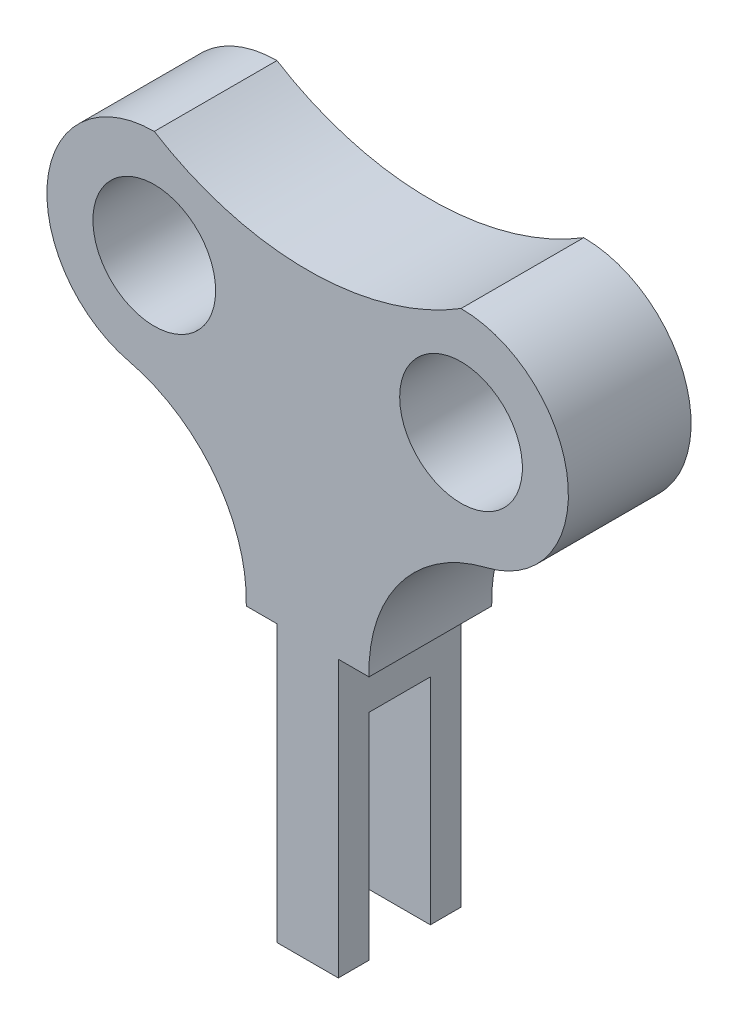
ISO-10303-21;
HEADER;
FILE_DESCRIPTION(('STEP AP214'),'2;1');
FILE_NAME('part.step','',(''),(''),'','','');
FILE_SCHEMA(('AUTOMOTIVE_DESIGN { 1 0 10303 214 1 1 1 1 }'));
ENDSEC;
DATA;
#1=APPLICATION_CONTEXT('core data for automotive mechanical design processes');
#2=APPLICATION_PROTOCOL_DEFINITION('international standard','automotive_design',2000,#1);
#3=PRODUCT_CONTEXT('',#1,'mechanical');
#4=PRODUCT('Part','Part','',(#3));
#5=PRODUCT_RELATED_PRODUCT_CATEGORY('part','',(#4));
#6=PRODUCT_DEFINITION_FORMATION('','',#4);
#7=PRODUCT_DEFINITION_CONTEXT('part definition',#1,'design');
#8=PRODUCT_DEFINITION('design','',#6,#7);
#9=PRODUCT_DEFINITION_SHAPE('','',#8);
#10=(LENGTH_UNIT() NAMED_UNIT(*) SI_UNIT(.MILLI.,.METRE.));
#11=(NAMED_UNIT(*) PLANE_ANGLE_UNIT() SI_UNIT($,.RADIAN.));
#12=(NAMED_UNIT(*) SI_UNIT($,.STERADIAN.) SOLID_ANGLE_UNIT());
#13=UNCERTAINTY_MEASURE_WITH_UNIT(LENGTH_MEASURE(1.E-05),#10,'distance_accuracy_value','');
#14=(GEOMETRIC_REPRESENTATION_CONTEXT(3) GLOBAL_UNCERTAINTY_ASSIGNED_CONTEXT((#13)) GLOBAL_UNIT_ASSIGNED_CONTEXT((#10,
#11,#12)) REPRESENTATION_CONTEXT('',''));
#15=CARTESIAN_POINT('',(0.,0.,0.));
#16=DIRECTION('',(0.,0.,1.));
#17=DIRECTION('',(1.,0.,0.));
#18=AXIS2_PLACEMENT_3D('',#15,#16,#17);
#19=CARTESIAN_POINT('',(-4.99999999999998,-87.,20.));
#20=DIRECTION('',(0.,1.,0.));
#21=DIRECTION('',(0.,0.,1.));
#22=AXIS2_PLACEMENT_3D('',#19,#20,#21);
#23=PLANE('',#22);
#24=DIRECTION('',(0.,0.,-1.));
#25=VECTOR('',#24,1.);
#26=CARTESIAN_POINT('',(-4.99999999999998,-87.,20.));
#27=LINE('',#26,#25);
#28=CARTESIAN_POINT('',(-4.99999999999998,-87.,20.));
#29=VERTEX_POINT('',#28);
#30=CARTESIAN_POINT('',(-4.99999999999998,-87.,15.));
#31=VERTEX_POINT('',#30);
#32=EDGE_CURVE('E213',#29,#31,#27,.T.);
#33=ORIENTED_EDGE('',*,*,#32,.T.);
#34=DIRECTION('',(1.,0.,0.));
#35=VECTOR('',#34,1.);
#36=CARTESIAN_POINT('',(-41.4005494464026,-87.,15.));
#37=LINE('',#36,#35);
#38=CARTESIAN_POINT('',(5.00000000000002,-87.,15.));
#39=VERTEX_POINT('',#38);
#40=EDGE_CURVE('E284',#31,#39,#37,.T.);
#41=ORIENTED_EDGE('',*,*,#40,.T.);
#42=DIRECTION('',(0.,0.,-1.));
#43=VECTOR('',#42,1.);
#44=CARTESIAN_POINT('',(5.00000000000002,-87.,20.));
#45=LINE('',#44,#43);
#46=CARTESIAN_POINT('',(5.00000000000002,-87.,20.));
#47=VERTEX_POINT('',#46);
#48=EDGE_CURVE('E208',#47,#39,#45,.T.);
#49=ORIENTED_EDGE('',*,*,#48,.F.);
#50=DIRECTION('',(1.,0.,0.));
#51=VECTOR('',#50,1.);
#52=CARTESIAN_POINT('',(-4.99999999999998,-87.,20.));
#53=LINE('',#52,#51);
#54=EDGE_CURVE('E253',#29,#47,#53,.T.);
#55=ORIENTED_EDGE('',*,*,#54,.F.);
#56=EDGE_LOOP('',(#33,#41,#49,#55));
#57=FACE_BOUND('',#56,.T.);
#58=ADVANCED_FACE('F41',(#57),#23,.F.);
#59=CARTESIAN_POINT('',(0.,58.,20.));
#60=DIRECTION('',(0.,0.,1.));
#61=DIRECTION('',(1.,0.,0.));
#62=AXIS2_PLACEMENT_3D('',#59,#60,#61);
#63=PLANE('',#62);
#64=CARTESIAN_POINT('',(-25.,0.,20.));
#65=DIRECTION('',(0.,0.,1.));
#66=DIRECTION('',(1.,0.,0.));
#67=AXIS2_PLACEMENT_3D('',#64,#65,#66);
#68=CIRCLE('',#67,10.);
#69=CARTESIAN_POINT('',(-15.,0.,20.));
#70=VERTEX_POINT('',#69);
#71=EDGE_CURVE('E173',#70,#70,#68,.T.);
#72=ORIENTED_EDGE('',*,*,#71,.F.);
#73=EDGE_LOOP('',(#72));
#74=FACE_BOUND('',#73,.T.);
#75=CARTESIAN_POINT('',(0.,58.,20.));
#76=DIRECTION('',(0.,0.,-1.));
#77=DIRECTION('',(1.,0.,0.));
#78=AXIS2_PLACEMENT_3D('',#75,#76,#77);
#79=CIRCLE('',#78,47.594642555649);
#80=CARTESIAN_POINT('',(25.,17.5,20.));
#81=VERTEX_POINT('',#80);
#82=CARTESIAN_POINT('',(-25.,17.5,20.));
#83=VERTEX_POINT('',#82);
#84=EDGE_CURVE('E200',#81,#83,#79,.T.);
#85=ORIENTED_EDGE('',*,*,#84,.T.);
#86=CARTESIAN_POINT('',(-25.,0.,20.));
#87=DIRECTION('',(0.,0.,1.));
#88=DIRECTION('',(1.,0.,0.));
#89=AXIS2_PLACEMENT_3D('',#86,#87,#88);
#90=CIRCLE('',#89,17.5);
#91=CARTESIAN_POINT('',(-29.1137151317504,-17.0096251520958,20.));
#92=VERTEX_POINT('',#91);
#93=EDGE_CURVE('E113',#83,#92,#90,.T.);
#94=ORIENTED_EDGE('',*,*,#93,.T.);
#95=CARTESIAN_POINT('',(-34.990451034251,-41.3090896550897,20.));
#96=DIRECTION('',(0.,0.,-1.));
#97=DIRECTION('',(1.,0.,0.));
#98=AXIS2_PLACEMENT_3D('',#95,#96,#97);
#99=CIRCLE('',#98,25.);
#100=CARTESIAN_POINT('',(-9.99999999999999,-42.,20.));
#101=VERTEX_POINT('',#100);
#102=EDGE_CURVE('E231',#92,#101,#99,.T.);
#103=ORIENTED_EDGE('',*,*,#102,.T.);
#104=DIRECTION('',(1.,0.,0.));
#105=VECTOR('',#104,1.);
#106=CARTESIAN_POINT('',(-9.99999999999999,-42.,20.));
#107=LINE('',#106,#105);
#108=CARTESIAN_POINT('',(-4.99999999999999,-42.,20.));
#109=VERTEX_POINT('',#108);
#110=EDGE_CURVE('E254',#101,#109,#107,.T.);
#111=ORIENTED_EDGE('',*,*,#110,.T.);
#112=DIRECTION('',(0.,-1.,0.));
#113=VECTOR('',#112,1.);
#114=CARTESIAN_POINT('',(-4.99999999999998,-87.,20.));
#115=LINE('',#114,#113);
#116=EDGE_CURVE('E249',#109,#29,#115,.T.);
#117=ORIENTED_EDGE('',*,*,#116,.T.);
#118=ORIENTED_EDGE('',*,*,#54,.T.);
#119=DIRECTION('',(0.,1.,0.));
#120=VECTOR('',#119,1.);
#121=CARTESIAN_POINT('',(5.00000000000002,-87.,20.));
#122=LINE('',#121,#120);
#123=CARTESIAN_POINT('',(5.00000000000002,-42.,20.));
#124=VERTEX_POINT('',#123);
#125=EDGE_CURVE('E143',#47,#124,#122,.T.);
#126=ORIENTED_EDGE('',*,*,#125,.T.);
#127=DIRECTION('',(1.,0.,0.));
#128=VECTOR('',#127,1.);
#129=CARTESIAN_POINT('',(5.00000000000002,-42.,20.));
#130=LINE('',#129,#128);
#131=CARTESIAN_POINT('',(10.,-42.,20.));
#132=VERTEX_POINT('',#131);
#133=EDGE_CURVE('E135',#124,#132,#130,.T.);
#134=ORIENTED_EDGE('',*,*,#133,.T.);
#135=CARTESIAN_POINT('',(34.990451034251,-41.3090896550897,20.));
#136=DIRECTION('',(0.,0.,-1.));
#137=DIRECTION('',(-1.,0.,0.));
#138=AXIS2_PLACEMENT_3D('',#135,#136,#137);
#139=CIRCLE('',#138,25.);
#140=CARTESIAN_POINT('',(29.1137151317504,-17.0096251520958,20.));
#141=VERTEX_POINT('',#140);
#142=EDGE_CURVE('E140',#132,#141,#139,.T.);
#143=ORIENTED_EDGE('',*,*,#142,.T.);
#144=CARTESIAN_POINT('',(25.,0.,20.));
#145=DIRECTION('',(0.,0.,1.));
#146=DIRECTION('',(-1.,0.,0.));
#147=AXIS2_PLACEMENT_3D('',#144,#145,#146);
#148=CIRCLE('',#147,17.5);
#149=EDGE_CURVE('E66',#141,#81,#148,.T.);
#150=ORIENTED_EDGE('',*,*,#149,.T.);
#151=EDGE_LOOP('',(#85,#94,#103,#111,#117,#118,#126,#134,#143,#150));
#152=FACE_BOUND('',#151,.T.);
#153=CARTESIAN_POINT('',(25.,0.,20.));
#154=DIRECTION('',(0.,0.,1.));
#155=DIRECTION('',(-1.,0.,0.));
#156=AXIS2_PLACEMENT_3D('',#153,#154,#155);
#157=CIRCLE('',#156,10.);
#158=CARTESIAN_POINT('',(15.,0.,20.));
#159=VERTEX_POINT('',#158);
#160=EDGE_CURVE('E272',#159,#159,#157,.T.);
#161=ORIENTED_EDGE('',*,*,#160,.F.);
#162=EDGE_LOOP('',(#161));
#163=FACE_BOUND('',#162,.T.);
#164=ADVANCED_FACE('F137',(#74,#152,#163),#63,.T.);
#165=CARTESIAN_POINT('',(0.,58.,0.));
#166=DIRECTION('',(0.,0.,1.));
#167=DIRECTION('',(1.,0.,0.));
#168=AXIS2_PLACEMENT_3D('',#165,#166,#167);
#169=PLANE('',#168);
#170=CARTESIAN_POINT('',(0.,58.,0.));
#171=DIRECTION('',(0.,0.,-1.));
#172=DIRECTION('',(1.,0.,0.));
#173=AXIS2_PLACEMENT_3D('',#170,#171,#172);
#174=CIRCLE('',#173,47.594642555649);
#175=CARTESIAN_POINT('',(25.,17.5,0.));
#176=VERTEX_POINT('',#175);
#177=CARTESIAN_POINT('',(-25.,17.5,0.));
#178=VERTEX_POINT('',#177);
#179=EDGE_CURVE('E168',#176,#178,#174,.T.);
#180=ORIENTED_EDGE('',*,*,#179,.F.);
#181=CARTESIAN_POINT('',(25.,0.,0.));
#182=DIRECTION('',(0.,0.,1.));
#183=DIRECTION('',(-1.,0.,0.));
#184=AXIS2_PLACEMENT_3D('',#181,#182,#183);
#185=CIRCLE('',#184,17.5);
#186=CARTESIAN_POINT('',(29.1137151317504,-17.0096251520958,0.));
#187=VERTEX_POINT('',#186);
#188=EDGE_CURVE('E105',#187,#176,#185,.T.);
#189=ORIENTED_EDGE('',*,*,#188,.F.);
#190=CARTESIAN_POINT('',(34.990451034251,-41.3090896550897,0.));
#191=DIRECTION('',(0.,0.,-1.));
#192=DIRECTION('',(-1.,0.,0.));
#193=AXIS2_PLACEMENT_3D('',#190,#191,#192);
#194=CIRCLE('',#193,25.);
#195=CARTESIAN_POINT('',(10.,-42.,0.));
#196=VERTEX_POINT('',#195);
#197=EDGE_CURVE('E195',#196,#187,#194,.T.);
#198=ORIENTED_EDGE('',*,*,#197,.F.);
#199=DIRECTION('',(1.,0.,0.));
#200=VECTOR('',#199,1.);
#201=CARTESIAN_POINT('',(5.00000000000002,-42.,0.));
#202=LINE('',#201,#200);
#203=CARTESIAN_POINT('',(5.00000000000002,-42.,0.));
#204=VERTEX_POINT('',#203);
#205=EDGE_CURVE('E153',#204,#196,#202,.T.);
#206=ORIENTED_EDGE('',*,*,#205,.F.);
#207=DIRECTION('',(0.,1.,0.));
#208=VECTOR('',#207,1.);
#209=CARTESIAN_POINT('',(5.00000000000002,-87.,0.));
#210=LINE('',#209,#208);
#211=CARTESIAN_POINT('',(5.00000000000002,-87.,0.));
#212=VERTEX_POINT('',#211);
#213=EDGE_CURVE('E190',#212,#204,#210,.T.);
#214=ORIENTED_EDGE('',*,*,#213,.F.);
#215=DIRECTION('',(1.,0.,0.));
#216=VECTOR('',#215,1.);
#217=CARTESIAN_POINT('',(-4.99999999999998,-87.,0.));
#218=LINE('',#217,#216);
#219=CARTESIAN_POINT('',(-4.99999999999998,-87.,0.));
#220=VERTEX_POINT('',#219);
#221=EDGE_CURVE('E186',#220,#212,#218,.T.);
#222=ORIENTED_EDGE('',*,*,#221,.F.);
#223=DIRECTION('',(0.,-1.,0.));
#224=VECTOR('',#223,1.);
#225=CARTESIAN_POINT('',(-4.99999999999998,-87.,0.));
#226=LINE('',#225,#224);
#227=CARTESIAN_POINT('',(-4.99999999999999,-42.,0.));
#228=VERTEX_POINT('',#227);
#229=EDGE_CURVE('E182',#228,#220,#226,.T.);
#230=ORIENTED_EDGE('',*,*,#229,.F.);
#231=DIRECTION('',(1.,0.,0.));
#232=VECTOR('',#231,1.);
#233=CARTESIAN_POINT('',(-9.99999999999999,-42.,0.));
#234=LINE('',#233,#232);
#235=CARTESIAN_POINT('',(-9.99999999999999,-42.,0.));
#236=VERTEX_POINT('',#235);
#237=EDGE_CURVE('E179',#236,#228,#234,.T.);
#238=ORIENTED_EDGE('',*,*,#237,.F.);
#239=CARTESIAN_POINT('',(-34.990451034251,-41.3090896550897,0.));
#240=DIRECTION('',(0.,0.,-1.));
#241=DIRECTION('',(1.,0.,0.));
#242=AXIS2_PLACEMENT_3D('',#239,#240,#241);
#243=CIRCLE('',#242,25.);
#244=CARTESIAN_POINT('',(-29.1137151317504,-17.0096251520958,0.));
#245=VERTEX_POINT('',#244);
#246=EDGE_CURVE('E176',#245,#236,#243,.T.);
#247=ORIENTED_EDGE('',*,*,#246,.F.);
#248=CARTESIAN_POINT('',(-25.,0.,0.));
#249=DIRECTION('',(0.,0.,1.));
#250=DIRECTION('',(1.,0.,0.));
#251=AXIS2_PLACEMENT_3D('',#248,#249,#250);
#252=CIRCLE('',#251,17.5);
#253=EDGE_CURVE('E172',#178,#245,#252,.T.);
#254=ORIENTED_EDGE('',*,*,#253,.F.);
#255=EDGE_LOOP('',(#180,#189,#198,#206,#214,#222,#230,#238,#247,#254));
#256=FACE_BOUND('',#255,.T.);
#257=CARTESIAN_POINT('',(-25.,0.,0.));
#258=DIRECTION('',(0.,0.,1.));
#259=DIRECTION('',(1.,0.,0.));
#260=AXIS2_PLACEMENT_3D('',#257,#258,#259);
#261=CIRCLE('',#260,10.);
#262=CARTESIAN_POINT('',(-15.,0.,0.));
#263=VERTEX_POINT('',#262);
#264=EDGE_CURVE('E268',#263,#263,#261,.T.);
#265=ORIENTED_EDGE('',*,*,#264,.T.);
#266=EDGE_LOOP('',(#265));
#267=FACE_BOUND('',#266,.T.);
#268=CARTESIAN_POINT('',(25.,0.,0.));
#269=DIRECTION('',(0.,0.,1.));
#270=DIRECTION('',(-1.,0.,0.));
#271=AXIS2_PLACEMENT_3D('',#268,#269,#270);
#272=CIRCLE('',#271,10.);
#273=CARTESIAN_POINT('',(15.,0.,0.));
#274=VERTEX_POINT('',#273);
#275=EDGE_CURVE('E276',#274,#274,#272,.T.);
#276=ORIENTED_EDGE('',*,*,#275,.T.);
#277=EDGE_LOOP('',(#276));
#278=FACE_BOUND('',#277,.T.);
#279=ADVANCED_FACE('F235',(#256,#267,#278),#169,.F.);
#280=CARTESIAN_POINT('',(0.,58.,20.));
#281=DIRECTION('',(0.,0.,-1.));
#282=DIRECTION('',(-1.,0.,0.));
#283=AXIS2_PLACEMENT_3D('',#280,#281,#282);
#284=CYLINDRICAL_SURFACE('',#283,47.594642555649);
#285=ORIENTED_EDGE('',*,*,#179,.T.);
#286=DIRECTION('',(0.,0.,-1.));
#287=VECTOR('',#286,1.);
#288=CARTESIAN_POINT('',(-25.,17.5,20.));
#289=LINE('',#288,#287);
#290=EDGE_CURVE('E11',#83,#178,#289,.T.);
#291=ORIENTED_EDGE('',*,*,#290,.F.);
#292=ORIENTED_EDGE('',*,*,#84,.F.);
#293=DIRECTION('',(0.,0.,-1.));
#294=VECTOR('',#293,1.);
#295=CARTESIAN_POINT('',(25.,17.5,20.));
#296=LINE('',#295,#294);
#297=EDGE_CURVE('E164',#81,#176,#296,.T.);
#298=ORIENTED_EDGE('',*,*,#297,.T.);
#299=EDGE_LOOP('',(#285,#291,#292,#298));
#300=FACE_BOUND('',#299,.T.);
#301=ADVANCED_FACE('F43',(#300),#284,.F.);
#302=CARTESIAN_POINT('',(-25.,0.,20.));
#303=DIRECTION('',(0.,0.,-1.));
#304=DIRECTION('',(-1.,0.,0.));
#305=AXIS2_PLACEMENT_3D('',#302,#303,#304);
#306=CYLINDRICAL_SURFACE('',#305,17.5);
#307=ORIENTED_EDGE('',*,*,#253,.T.);
#308=DIRECTION('',(0.,0.,-1.));
#309=VECTOR('',#308,1.);
#310=CARTESIAN_POINT('',(-29.1137151317504,-17.0096251520958,20.));
#311=LINE('',#310,#309);
#312=EDGE_CURVE('E50',#92,#245,#311,.T.);
#313=ORIENTED_EDGE('',*,*,#312,.F.);
#314=ORIENTED_EDGE('',*,*,#93,.F.);
#315=ORIENTED_EDGE('',*,*,#290,.T.);
#316=EDGE_LOOP('',(#307,#313,#314,#315));
#317=FACE_BOUND('',#316,.T.);
#318=ADVANCED_FACE('F338',(#317),#306,.T.);
#319=CARTESIAN_POINT('',(-34.990451034251,-41.3090896550897,20.));
#320=DIRECTION('',(0.,0.,-1.));
#321=DIRECTION('',(-1.,0.,0.));
#322=AXIS2_PLACEMENT_3D('',#319,#320,#321);
#323=CYLINDRICAL_SURFACE('',#322,25.);
#324=ORIENTED_EDGE('',*,*,#246,.T.);
#325=DIRECTION('',(0.,0.,-1.));
#326=VECTOR('',#325,1.);
#327=CARTESIAN_POINT('',(-9.99999999999999,-42.,20.));
#328=LINE('',#327,#326);
#329=EDGE_CURVE('E221',#101,#236,#328,.T.);
#330=ORIENTED_EDGE('',*,*,#329,.F.);
#331=ORIENTED_EDGE('',*,*,#102,.F.);
#332=ORIENTED_EDGE('',*,*,#312,.T.);
#333=EDGE_LOOP('',(#324,#330,#331,#332));
#334=FACE_BOUND('',#333,.T.);
#335=ADVANCED_FACE('F229',(#334),#323,.F.);
#336=CARTESIAN_POINT('',(-9.99999999999999,-42.,20.));
#337=DIRECTION('',(0.,1.,0.));
#338=DIRECTION('',(0.,0.,1.));
#339=AXIS2_PLACEMENT_3D('',#336,#337,#338);
#340=PLANE('',#339);
#341=ORIENTED_EDGE('',*,*,#237,.T.);
#342=DIRECTION('',(0.,0.,-1.));
#343=VECTOR('',#342,1.);
#344=CARTESIAN_POINT('',(-4.99999999999999,-42.,20.));
#345=LINE('',#344,#343);
#346=EDGE_CURVE('E217',#109,#228,#345,.T.);
#347=ORIENTED_EDGE('',*,*,#346,.F.);
#348=ORIENTED_EDGE('',*,*,#110,.F.);
#349=ORIENTED_EDGE('',*,*,#329,.T.);
#350=EDGE_LOOP('',(#341,#347,#348,#349));
#351=FACE_BOUND('',#350,.T.);
#352=ADVANCED_FACE('F241',(#351),#340,.F.);
#353=CARTESIAN_POINT('',(-4.99999999999998,-87.,20.));
#354=DIRECTION('',(1.,0.,0.));
#355=DIRECTION('',(0.,1.,0.));
#356=AXIS2_PLACEMENT_3D('',#353,#354,#355);
#357=PLANE('',#356);
#358=DIRECTION('',(0.,0.,-1.));
#359=VECTOR('',#358,1.);
#360=CARTESIAN_POINT('',(-4.99999999999999,-52.,15.));
#361=LINE('',#360,#359);
#362=CARTESIAN_POINT('',(-4.99999999999999,-52.,15.));
#363=VERTEX_POINT('',#362);
#364=CARTESIAN_POINT('',(-4.99999999999999,-52.,5.));
#365=VERTEX_POINT('',#364);
#366=EDGE_CURVE('E313',#363,#365,#361,.T.);
#367=ORIENTED_EDGE('',*,*,#366,.F.);
#368=DIRECTION('',(0.,1.,0.));
#369=VECTOR('',#368,1.);
#370=CARTESIAN_POINT('',(-4.99999999999999,-52.,15.));
#371=LINE('',#370,#369);
#372=EDGE_CURVE('E280',#31,#363,#371,.T.);
#373=ORIENTED_EDGE('',*,*,#372,.F.);
#374=ORIENTED_EDGE('',*,*,#32,.F.);
#375=ORIENTED_EDGE('',*,*,#116,.F.);
#376=ORIENTED_EDGE('',*,*,#346,.T.);
#377=ORIENTED_EDGE('',*,*,#229,.T.);
#378=CARTESIAN_POINT('',(-4.99999999999998,-87.,5.));
#379=VERTEX_POINT('',#378);
#380=EDGE_CURVE('E212',#379,#220,#27,.T.);
#381=ORIENTED_EDGE('',*,*,#380,.F.);
#382=DIRECTION('',(0.,-1.,0.));
#383=VECTOR('',#382,1.);
#384=CARTESIAN_POINT('',(-4.99999999999999,-52.,5.));
#385=LINE('',#384,#383);
#386=EDGE_CURVE('E299',#365,#379,#385,.T.);
#387=ORIENTED_EDGE('',*,*,#386,.F.);
#388=EDGE_LOOP('',(#367,#373,#374,#375,#376,#377,#381,#387));
#389=FACE_BOUND('',#388,.T.);
#390=ADVANCED_FACE('F246',(#389),#357,.F.);
#391=CARTESIAN_POINT('',(5.00000000000002,-87.,5.));
#392=VERTEX_POINT('',#391);
#393=EDGE_CURVE('E207',#392,#212,#45,.T.);
#394=ORIENTED_EDGE('',*,*,#393,.F.);
#395=DIRECTION('',(1.,0.,0.));
#396=VECTOR('',#395,1.);
#397=CARTESIAN_POINT('',(-41.4005494464026,-87.,5.));
#398=LINE('',#397,#396);
#399=EDGE_CURVE('E57',#379,#392,#398,.T.);
#400=ORIENTED_EDGE('',*,*,#399,.F.);
#401=ORIENTED_EDGE('',*,*,#380,.T.);
#402=ORIENTED_EDGE('',*,*,#221,.T.);
#403=EDGE_LOOP('',(#394,#400,#401,#402));
#404=FACE_BOUND('',#403,.T.);
#405=ADVANCED_FACE('F327',(#404),#23,.F.);
#406=CARTESIAN_POINT('',(5.00000000000002,-87.,20.));
#407=DIRECTION('',(-1.,0.,0.));
#408=DIRECTION('',(0.,0.,1.));
#409=AXIS2_PLACEMENT_3D('',#406,#407,#408);
#410=PLANE('',#409);
#411=ORIENTED_EDGE('',*,*,#48,.T.);
#412=DIRECTION('',(0.,-1.,0.));
#413=VECTOR('',#412,1.);
#414=CARTESIAN_POINT('',(5.00000000000002,-52.,15.));
#415=LINE('',#414,#413);
#416=CARTESIAN_POINT('',(5.00000000000002,-52.,15.));
#417=VERTEX_POINT('',#416);
#418=EDGE_CURVE('E306',#417,#39,#415,.T.);
#419=ORIENTED_EDGE('',*,*,#418,.F.);
#420=DIRECTION('',(0.,0.,1.));
#421=VECTOR('',#420,1.);
#422=CARTESIAN_POINT('',(5.00000000000002,-52.,15.));
#423=LINE('',#422,#421);
#424=CARTESIAN_POINT('',(5.00000000000002,-52.,5.));
#425=VERTEX_POINT('',#424);
#426=EDGE_CURVE('E288',#425,#417,#423,.T.);
#427=ORIENTED_EDGE('',*,*,#426,.F.);
#428=DIRECTION('',(0.,1.,0.));
#429=VECTOR('',#428,1.);
#430=CARTESIAN_POINT('',(5.00000000000002,-52.,5.));
#431=LINE('',#430,#429);
#432=EDGE_CURVE('E303',#392,#425,#431,.T.);
#433=ORIENTED_EDGE('',*,*,#432,.F.);
#434=ORIENTED_EDGE('',*,*,#393,.T.);
#435=ORIENTED_EDGE('',*,*,#213,.T.);
#436=DIRECTION('',(0.,0.,-1.));
#437=VECTOR('',#436,1.);
#438=CARTESIAN_POINT('',(5.00000000000002,-42.,20.));
#439=LINE('',#438,#437);
#440=EDGE_CURVE('E157',#124,#204,#439,.T.);
#441=ORIENTED_EDGE('',*,*,#440,.F.);
#442=ORIENTED_EDGE('',*,*,#125,.F.);
#443=EDGE_LOOP('',(#411,#419,#427,#433,#434,#435,#441,#442));
#444=FACE_BOUND('',#443,.T.);
#445=ADVANCED_FACE('F331',(#444),#410,.F.);
#446=CARTESIAN_POINT('',(5.00000000000002,-42.,20.));
#447=DIRECTION('',(0.,1.,0.));
#448=DIRECTION('',(0.,0.,1.));
#449=AXIS2_PLACEMENT_3D('',#446,#447,#448);
#450=PLANE('',#449);
#451=ORIENTED_EDGE('',*,*,#205,.T.);
#452=DIRECTION('',(0.,0.,-1.));
#453=VECTOR('',#452,1.);
#454=CARTESIAN_POINT('',(10.,-42.,20.));
#455=LINE('',#454,#453);
#456=EDGE_CURVE('E150',#132,#196,#455,.T.);
#457=ORIENTED_EDGE('',*,*,#456,.F.);
#458=ORIENTED_EDGE('',*,*,#133,.F.);
#459=ORIENTED_EDGE('',*,*,#440,.T.);
#460=EDGE_LOOP('',(#451,#457,#458,#459));
#461=FACE_BOUND('',#460,.T.);
#462=ADVANCED_FACE('F151',(#461),#450,.F.);
#463=CARTESIAN_POINT('',(34.990451034251,-41.3090896550897,20.));
#464=DIRECTION('',(0.,0.,-1.));
#465=DIRECTION('',(-1.,0.,0.));
#466=AXIS2_PLACEMENT_3D('',#463,#464,#465);
#467=CYLINDRICAL_SURFACE('',#466,25.);
#468=ORIENTED_EDGE('',*,*,#197,.T.);
#469=DIRECTION('',(0.,0.,-1.));
#470=VECTOR('',#469,1.);
#471=CARTESIAN_POINT('',(29.1137151317504,-17.0096251520958,20.));
#472=LINE('',#471,#470);
#473=EDGE_CURVE('E158',#141,#187,#472,.T.);
#474=ORIENTED_EDGE('',*,*,#473,.F.);
#475=ORIENTED_EDGE('',*,*,#142,.F.);
#476=ORIENTED_EDGE('',*,*,#456,.T.);
#477=EDGE_LOOP('',(#468,#474,#475,#476));
#478=FACE_BOUND('',#477,.T.);
#479=ADVANCED_FACE('F160',(#478),#467,.F.);
#480=CARTESIAN_POINT('',(25.,0.,20.));
#481=DIRECTION('',(0.,0.,-1.));
#482=DIRECTION('',(-1.,0.,0.));
#483=AXIS2_PLACEMENT_3D('',#480,#481,#482);
#484=CYLINDRICAL_SURFACE('',#483,17.5);
#485=ORIENTED_EDGE('',*,*,#188,.T.);
#486=ORIENTED_EDGE('',*,*,#297,.F.);
#487=ORIENTED_EDGE('',*,*,#149,.F.);
#488=ORIENTED_EDGE('',*,*,#473,.T.);
#489=EDGE_LOOP('',(#485,#486,#487,#488));
#490=FACE_BOUND('',#489,.T.);
#491=ADVANCED_FACE('F334',(#490),#484,.T.);
#492=CARTESIAN_POINT('',(-25.,0.,20.));
#493=DIRECTION('',(0.,0.,-1.));
#494=DIRECTION('',(-1.,0.,0.));
#495=AXIS2_PLACEMENT_3D('',#492,#493,#494);
#496=CYLINDRICAL_SURFACE('',#495,10.);
#497=ORIENTED_EDGE('',*,*,#71,.T.);
#498=EDGE_LOOP('',(#497));
#499=FACE_BOUND('',#498,.T.);
#500=ORIENTED_EDGE('',*,*,#264,.F.);
#501=EDGE_LOOP('',(#500));
#502=FACE_BOUND('',#501,.T.);
#503=ADVANCED_FACE('F385',(#499,#502),#496,.F.);
#504=CARTESIAN_POINT('',(25.,0.,20.));
#505=DIRECTION('',(0.,0.,-1.));
#506=DIRECTION('',(-1.,0.,0.));
#507=AXIS2_PLACEMENT_3D('',#504,#505,#506);
#508=CYLINDRICAL_SURFACE('',#507,10.);
#509=ORIENTED_EDGE('',*,*,#160,.T.);
#510=EDGE_LOOP('',(#509));
#511=FACE_BOUND('',#510,.T.);
#512=ORIENTED_EDGE('',*,*,#275,.F.);
#513=EDGE_LOOP('',(#512));
#514=FACE_BOUND('',#513,.T.);
#515=ADVANCED_FACE('F417',(#511,#514),#508,.F.);
#516=CARTESIAN_POINT('',(-41.4005494464026,-52.,15.));
#517=DIRECTION('',(0.,0.,1.));
#518=DIRECTION('',(0.,-1.,0.));
#519=AXIS2_PLACEMENT_3D('',#516,#517,#518);
#520=PLANE('',#519);
#521=ORIENTED_EDGE('',*,*,#372,.T.);
#522=DIRECTION('',(1.,0.,0.));
#523=VECTOR('',#522,1.);
#524=CARTESIAN_POINT('',(-41.4005494464026,-52.,15.));
#525=LINE('',#524,#523);
#526=EDGE_CURVE('E295',#363,#417,#525,.T.);
#527=ORIENTED_EDGE('',*,*,#526,.T.);
#528=ORIENTED_EDGE('',*,*,#418,.T.);
#529=ORIENTED_EDGE('',*,*,#40,.F.);
#530=EDGE_LOOP('',(#521,#527,#528,#529));
#531=FACE_BOUND('',#530,.T.);
#532=ADVANCED_FACE('F426',(#531),#520,.F.);
#533=CARTESIAN_POINT('',(-41.4005494464026,-52.,15.));
#534=DIRECTION('',(0.,1.,0.));
#535=DIRECTION('',(0.,0.,1.));
#536=AXIS2_PLACEMENT_3D('',#533,#534,#535);
#537=PLANE('',#536);
#538=ORIENTED_EDGE('',*,*,#366,.T.);
#539=DIRECTION('',(1.,0.,0.));
#540=VECTOR('',#539,1.);
#541=CARTESIAN_POINT('',(-41.4005494464026,-52.,5.));
#542=LINE('',#541,#540);
#543=EDGE_CURVE('E291',#365,#425,#542,.T.);
#544=ORIENTED_EDGE('',*,*,#543,.T.);
#545=ORIENTED_EDGE('',*,*,#426,.T.);
#546=ORIENTED_EDGE('',*,*,#526,.F.);
#547=EDGE_LOOP('',(#538,#544,#545,#546));
#548=FACE_BOUND('',#547,.T.);
#549=ADVANCED_FACE('F436',(#548),#537,.F.);
#550=CARTESIAN_POINT('',(-41.4005494464026,-52.,5.));
#551=DIRECTION('',(0.,0.,-1.));
#552=DIRECTION('',(0.,1.,0.));
#553=AXIS2_PLACEMENT_3D('',#550,#551,#552);
#554=PLANE('',#553);
#555=ORIENTED_EDGE('',*,*,#386,.T.);
#556=ORIENTED_EDGE('',*,*,#399,.T.);
#557=ORIENTED_EDGE('',*,*,#432,.T.);
#558=ORIENTED_EDGE('',*,*,#543,.F.);
#559=EDGE_LOOP('',(#555,#556,#557,#558));
#560=FACE_BOUND('',#559,.T.);
#561=ADVANCED_FACE('F321',(#560),#554,.F.);
#562=CLOSED_SHELL('',(#58,#164,#279,#301,#318,#335,#352,#390,#405,#445,#462,#479,#491,#503,#515,
#532,#549,#561));
#563=MANIFOLD_SOLID_BREP('B2',#562);
#564=ADVANCED_BREP_SHAPE_REPRESENTATION('',(#18,#563),#14);
#565=SHAPE_DEFINITION_REPRESENTATION(#9,#564);
ENDSEC;
END-ISO-10303-21;
